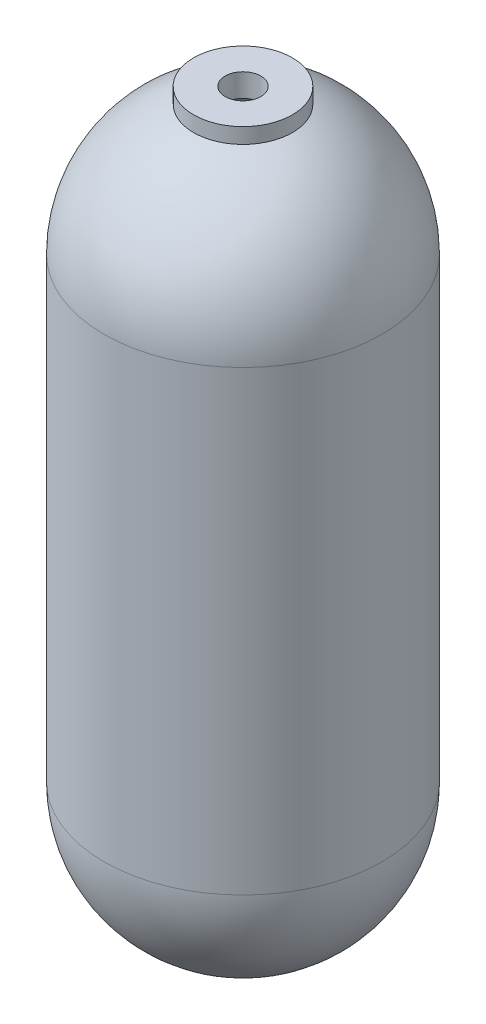
ISO-10303-21;
HEADER;
FILE_DESCRIPTION(('STEP AP214'),'2;1');
FILE_NAME('part.step','',(''),(''),'','','');
FILE_SCHEMA(('AUTOMOTIVE_DESIGN { 1 0 10303 214 1 1 1 1 }'));
ENDSEC;
DATA;
#1=APPLICATION_CONTEXT('core data for automotive mechanical design processes');
#2=APPLICATION_PROTOCOL_DEFINITION('international standard','automotive_design',2000,#1);
#3=PRODUCT_CONTEXT('',#1,'mechanical');
#4=PRODUCT('Part','Part','',(#3));
#5=PRODUCT_RELATED_PRODUCT_CATEGORY('part','',(#4));
#6=PRODUCT_DEFINITION_FORMATION('','',#4);
#7=PRODUCT_DEFINITION_CONTEXT('part definition',#1,'design');
#8=PRODUCT_DEFINITION('design','',#6,#7);
#9=PRODUCT_DEFINITION_SHAPE('','',#8);
#10=(LENGTH_UNIT() NAMED_UNIT(*) SI_UNIT(.MILLI.,.METRE.));
#11=(NAMED_UNIT(*) PLANE_ANGLE_UNIT() SI_UNIT($,.RADIAN.));
#12=(NAMED_UNIT(*) SI_UNIT($,.STERADIAN.) SOLID_ANGLE_UNIT());
#13=UNCERTAINTY_MEASURE_WITH_UNIT(LENGTH_MEASURE(1.E-05),#10,'distance_accuracy_value','');
#14=(GEOMETRIC_REPRESENTATION_CONTEXT(3) GLOBAL_UNCERTAINTY_ASSIGNED_CONTEXT((#13)) GLOBAL_UNIT_ASSIGNED_CONTEXT((#10,
#11,#12)) REPRESENTATION_CONTEXT('',''));
#15=CARTESIAN_POINT('',(0.,0.,0.));
#16=DIRECTION('',(0.,0.,1.));
#17=DIRECTION('',(1.,0.,0.));
#18=AXIS2_PLACEMENT_3D('',#15,#16,#17);
#19=CARTESIAN_POINT('',(13.97,59.7655417458253,0.));
#20=DIRECTION('',(0.,-1.,0.));
#21=DIRECTION('',(1.,0.,0.));
#22=AXIS2_PLACEMENT_3D('',#19,#20,#21);
#23=PLANE('',#22);
#24=CARTESIAN_POINT('',(0.,59.7655417458253,0.));
#25=DIRECTION('',(0.,1.,0.));
#26=DIRECTION('',(0.,0.,1.));
#27=AXIS2_PLACEMENT_3D('',#24,#25,#26);
#28=CIRCLE('',#27,7.34186999999999);
#29=CARTESIAN_POINT('',(0.,59.7655417458253,7.34186999999999));
#30=VERTEX_POINT('',#29);
#31=EDGE_CURVE('E71',#30,#30,#28,.T.);
#32=ORIENTED_EDGE('',*,*,#31,.F.);
#33=EDGE_LOOP('',(#32));
#34=FACE_BOUND('',#33,.T.);
#35=CARTESIAN_POINT('',(0.,59.7655417458253,0.));
#36=DIRECTION('',(0.,1.,0.));
#37=DIRECTION('',(-1.,0.,0.));
#38=AXIS2_PLACEMENT_3D('',#35,#36,#37);
#39=CIRCLE('',#38,20.32);
#40=CARTESIAN_POINT('',(-20.32,59.7655417458253,0.));
#41=VERTEX_POINT('',#40);
#42=EDGE_CURVE('E63',#41,#41,#39,.T.);
#43=ORIENTED_EDGE('',*,*,#42,.T.);
#44=EDGE_LOOP('',(#43));
#45=FACE_BOUND('',#44,.T.);
#46=ADVANCED_FACE('F36',(#34,#45),#23,.F.);
#47=CARTESIAN_POINT('',(0.,-187.884458254175,0.));
#48=DIRECTION('',(0.,1.,0.));
#49=DIRECTION('',(1.,0.,0.));
#50=AXIS2_PLACEMENT_3D('',#47,#48,#49);
#51=SPHERICAL_SURFACE('',#50,57.15);
#52=CARTESIAN_POINT('',(0.,-187.884458254175,0.));
#53=DIRECTION('',(0.,1.,0.));
#54=DIRECTION('',(-1.,0.,0.));
#55=AXIS2_PLACEMENT_3D('',#52,#53,#54);
#56=CIRCLE('',#55,57.15);
#57=CARTESIAN_POINT('',(-57.15,-187.884458254175,0.));
#58=VERTEX_POINT('',#57);
#59=EDGE_CURVE('E50',#58,#58,#56,.T.);
#60=ORIENTED_EDGE('',*,*,#59,.F.);
#61=EDGE_LOOP('',(#60));
#62=FACE_BOUND('',#61,.T.);
#63=ADVANCED_FACE('F81',(#62),#51,.T.);
#64=CARTESIAN_POINT('',(0.,80.4478853232941,0.));
#65=DIRECTION('',(0.,1.,0.));
#66=DIRECTION('',(-1.,0.,0.));
#67=AXIS2_PLACEMENT_3D('',#64,#65,#66);
#68=CYLINDRICAL_SURFACE('',#67,57.15);
#69=CARTESIAN_POINT('',(0.,0.,0.));
#70=DIRECTION('',(0.,1.,0.));
#71=DIRECTION('',(-1.,0.,0.));
#72=AXIS2_PLACEMENT_3D('',#69,#70,#71);
#73=CIRCLE('',#72,57.15);
#74=CARTESIAN_POINT('',(-57.15,0.,0.));
#75=VERTEX_POINT('',#74);
#76=EDGE_CURVE('E54',#75,#75,#73,.T.);
#77=ORIENTED_EDGE('',*,*,#76,.F.);
#78=EDGE_LOOP('',(#77));
#79=FACE_BOUND('',#78,.T.);
#80=ORIENTED_EDGE('',*,*,#59,.T.);
#81=EDGE_LOOP('',(#80));
#82=FACE_BOUND('',#81,.T.);
#83=ADVANCED_FACE('F93',(#79,#82),#68,.T.);
#84=CARTESIAN_POINT('',(0.,0.,0.));
#85=DIRECTION('',(0.,1.,0.));
#86=DIRECTION('',(1.,0.,0.));
#87=AXIS2_PLACEMENT_3D('',#84,#85,#86);
#88=SPHERICAL_SURFACE('',#87,57.15);
#89=CARTESIAN_POINT('',(0.,53.4155417458253,0.));
#90=DIRECTION('',(0.,1.,0.));
#91=DIRECTION('',(-1.,0.,0.));
#92=AXIS2_PLACEMENT_3D('',#89,#90,#91);
#93=CIRCLE('',#92,20.32);
#94=CARTESIAN_POINT('',(-20.32,53.4155417458253,0.));
#95=VERTEX_POINT('',#94);
#96=EDGE_CURVE('E59',#95,#95,#93,.T.);
#97=ORIENTED_EDGE('',*,*,#96,.F.);
#98=EDGE_LOOP('',(#97));
#99=FACE_BOUND('',#98,.T.);
#100=ORIENTED_EDGE('',*,*,#76,.T.);
#101=EDGE_LOOP('',(#100));
#102=FACE_BOUND('',#101,.T.);
#103=ADVANCED_FACE('F87',(#99,#102),#88,.T.);
#104=CARTESIAN_POINT('',(0.,80.4478853232941,0.));
#105=DIRECTION('',(0.,1.,0.));
#106=DIRECTION('',(-1.,0.,0.));
#107=AXIS2_PLACEMENT_3D('',#104,#105,#106);
#108=CYLINDRICAL_SURFACE('',#107,20.32);
#109=ORIENTED_EDGE('',*,*,#42,.F.);
#110=EDGE_LOOP('',(#109));
#111=FACE_BOUND('',#110,.T.);
#112=ORIENTED_EDGE('',*,*,#96,.T.);
#113=EDGE_LOOP('',(#112));
#114=FACE_BOUND('',#113,.T.);
#115=ADVANCED_FACE('F84',(#111,#114),#108,.T.);
#116=CARTESIAN_POINT('',(0.,59.7655417458253,0.));
#117=DIRECTION('',(0.,1.,0.));
#118=DIRECTION('',(0.,0.,1.));
#119=AXIS2_PLACEMENT_3D('',#116,#117,#118);
#120=CYLINDRICAL_SURFACE('',#119,7.34186999999999);
#121=ORIENTED_EDGE('',*,*,#31,.T.);
#122=EDGE_LOOP('',(#121));
#123=FACE_BOUND('',#122,.T.);
#124=CARTESIAN_POINT('',(0.,50.2666583821036,0.));
#125=DIRECTION('',(0.,-1.,0.));
#126=DIRECTION('',(0.,0.,-1.));
#127=AXIS2_PLACEMENT_3D('',#124,#125,#126);
#128=CIRCLE('',#127,7.34186999999999);
#129=CARTESIAN_POINT('',(0.,50.2666583821036,-7.34186999999999));
#130=VERTEX_POINT('',#129);
#131=EDGE_CURVE('E67',#130,#130,#128,.F.);
#132=ORIENTED_EDGE('',*,*,#131,.F.);
#133=EDGE_LOOP('',(#132));
#134=FACE_BOUND('',#133,.T.);
#135=ADVANCED_FACE('F76',(#123,#134),#120,.F.);
#136=CARTESIAN_POINT('',(0.,-187.884458254175,0.));
#137=DIRECTION('',(0.,1.,0.));
#138=DIRECTION('',(1.,0.,0.));
#139=AXIS2_PLACEMENT_3D('',#136,#137,#138);
#140=SPHERICAL_SURFACE('',#139,50.8);
#141=CARTESIAN_POINT('',(0.,-187.884458254175,0.));
#142=DIRECTION('',(0.,1.,0.));
#143=DIRECTION('',(-1.,0.,0.));
#144=AXIS2_PLACEMENT_3D('',#141,#142,#143);
#145=CIRCLE('',#144,50.8);
#146=CARTESIAN_POINT('',(-50.8,-187.884458254175,0.));
#147=VERTEX_POINT('',#146);
#148=EDGE_CURVE('E43',#147,#147,#145,.T.);
#149=ORIENTED_EDGE('',*,*,#148,.T.);
#150=EDGE_LOOP('',(#149));
#151=FACE_BOUND('',#150,.T.);
#152=ADVANCED_FACE('F108',(#151),#140,.F.);
#153=CARTESIAN_POINT('',(0.,80.4478853232941,0.));
#154=DIRECTION('',(0.,1.,0.));
#155=DIRECTION('',(-1.,0.,0.));
#156=AXIS2_PLACEMENT_3D('',#153,#154,#155);
#157=CYLINDRICAL_SURFACE('',#156,50.8);
#158=ORIENTED_EDGE('',*,*,#148,.F.);
#159=EDGE_LOOP('',(#158));
#160=FACE_BOUND('',#159,.T.);
#161=CARTESIAN_POINT('',(0.,0.,0.));
#162=DIRECTION('',(0.,1.,0.));
#163=DIRECTION('',(-1.,0.,0.));
#164=AXIS2_PLACEMENT_3D('',#161,#162,#163);
#165=CIRCLE('',#164,50.8);
#166=CARTESIAN_POINT('',(-50.8,0.,0.));
#167=VERTEX_POINT('',#166);
#168=EDGE_CURVE('E10',#167,#167,#165,.T.);
#169=ORIENTED_EDGE('',*,*,#168,.T.);
#170=EDGE_LOOP('',(#169));
#171=FACE_BOUND('',#170,.T.);
#172=ADVANCED_FACE('F110',(#160,#171),#157,.F.);
#173=CARTESIAN_POINT('',(0.,0.,0.));
#174=DIRECTION('',(0.,1.,0.));
#175=DIRECTION('',(1.,0.,0.));
#176=AXIS2_PLACEMENT_3D('',#173,#174,#175);
#177=SPHERICAL_SURFACE('',#176,50.8);
#178=ORIENTED_EDGE('',*,*,#131,.T.);
#179=EDGE_LOOP('',(#178));
#180=FACE_BOUND('',#179,.T.);
#181=ORIENTED_EDGE('',*,*,#168,.F.);
#182=EDGE_LOOP('',(#181));
#183=FACE_BOUND('',#182,.T.);
#184=ADVANCED_FACE('F111',(#180,#183),#177,.F.);
#185=CLOSED_SHELL('',(#46,#63,#83,#103,#115,#135,#152,#172,#184));
#186=MANIFOLD_SOLID_BREP('B2',#185);
#187=ADVANCED_BREP_SHAPE_REPRESENTATION('',(#18,#186),#14);
#188=SHAPE_DEFINITION_REPRESENTATION(#9,#187);
ENDSEC;
END-ISO-10303-21;
